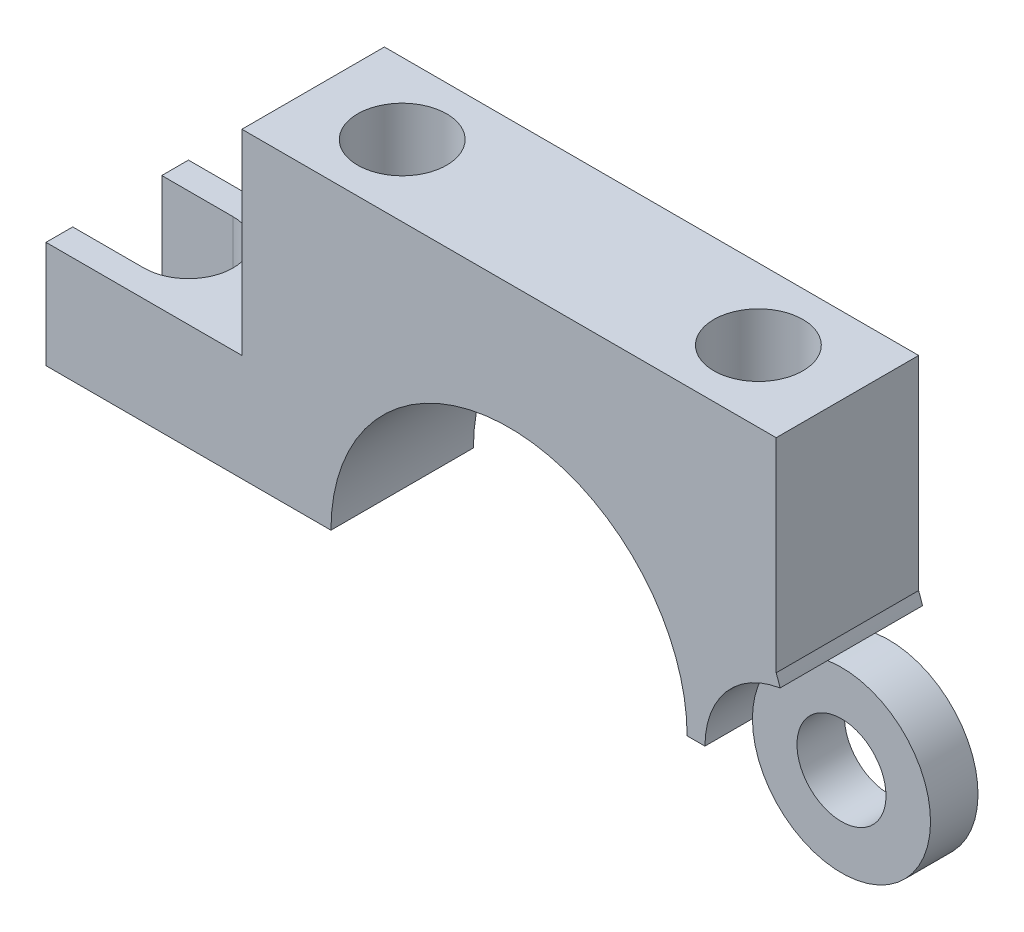
ISO-10303-21;
HEADER;
FILE_DESCRIPTION(('STEP AP214'),'2;1');
FILE_NAME('part.step','',(''),(''),'','','');
FILE_SCHEMA(('AUTOMOTIVE_DESIGN { 1 0 10303 214 1 1 1 1 }'));
ENDSEC;
DATA;
#1=APPLICATION_CONTEXT('core data for automotive mechanical design processes');
#2=APPLICATION_PROTOCOL_DEFINITION('international standard','automotive_design',2000,#1);
#3=PRODUCT_CONTEXT('',#1,'mechanical');
#4=PRODUCT('Part','Part','',(#3));
#5=PRODUCT_RELATED_PRODUCT_CATEGORY('part','',(#4));
#6=PRODUCT_DEFINITION_FORMATION('','',#4);
#7=PRODUCT_DEFINITION_CONTEXT('part definition',#1,'design');
#8=PRODUCT_DEFINITION('design','',#6,#7);
#9=PRODUCT_DEFINITION_SHAPE('','',#8);
#10=(LENGTH_UNIT() NAMED_UNIT(*) SI_UNIT(.MILLI.,.METRE.));
#11=(NAMED_UNIT(*) PLANE_ANGLE_UNIT() SI_UNIT($,.RADIAN.));
#12=(NAMED_UNIT(*) SI_UNIT($,.STERADIAN.) SOLID_ANGLE_UNIT());
#13=UNCERTAINTY_MEASURE_WITH_UNIT(LENGTH_MEASURE(1.E-05),#10,'distance_accuracy_value','');
#14=(GEOMETRIC_REPRESENTATION_CONTEXT(3) GLOBAL_UNCERTAINTY_ASSIGNED_CONTEXT((#13)) GLOBAL_UNIT_ASSIGNED_CONTEXT((#10,
#11,#12)) REPRESENTATION_CONTEXT('',''));
#15=CARTESIAN_POINT('',(0.,0.,0.));
#16=DIRECTION('',(0.,0.,1.));
#17=DIRECTION('',(1.,0.,0.));
#18=AXIS2_PLACEMENT_3D('',#15,#16,#17);
#19=CARTESIAN_POINT('',(0.,0.,2.));
#20=DIRECTION('',(0.,1.,0.));
#21=DIRECTION('',(0.,0.,1.));
#22=AXIS2_PLACEMENT_3D('',#19,#20,#21);
#23=PLANE('',#22);
#24=DIRECTION('',(0.,0.,-1.));
#25=VECTOR('',#24,1.);
#26=CARTESIAN_POINT('',(5.5,0.,9.07106781186548));
#27=LINE('',#26,#25);
#28=CARTESIAN_POINT('',(5.5,0.,2.));
#29=VERTEX_POINT('',#28);
#30=CARTESIAN_POINT('',(5.5,0.,0.666666666666667));
#31=VERTEX_POINT('',#30);
#32=EDGE_CURVE('E166',#29,#31,#27,.T.);
#33=ORIENTED_EDGE('',*,*,#32,.F.);
#34=DIRECTION('',(1.,0.,0.));
#35=VECTOR('',#34,1.);
#36=CARTESIAN_POINT('',(0.,0.,2.));
#37=LINE('',#36,#35);
#38=CARTESIAN_POINT('',(5.,0.,2.));
#39=VERTEX_POINT('',#38);
#40=EDGE_CURVE('E175',#39,#29,#37,.T.);
#41=ORIENTED_EDGE('',*,*,#40,.F.);
#42=DIRECTION('',(0.,0.,-1.));
#43=VECTOR('',#42,1.);
#44=CARTESIAN_POINT('',(5.,0.,2.));
#45=LINE('',#44,#43);
#46=CARTESIAN_POINT('',(5.,0.,-2.));
#47=VERTEX_POINT('',#46);
#48=EDGE_CURVE('E231',#39,#47,#45,.T.);
#49=ORIENTED_EDGE('',*,*,#48,.T.);
#50=DIRECTION('',(1.,0.,0.));
#51=VECTOR('',#50,1.);
#52=CARTESIAN_POINT('',(0.,0.,-2.));
#53=LINE('',#52,#51);
#54=CARTESIAN_POINT('',(5.5,0.,-2.));
#55=VERTEX_POINT('',#54);
#56=EDGE_CURVE('E206',#47,#55,#53,.T.);
#57=ORIENTED_EDGE('',*,*,#56,.T.);
#58=DIRECTION('',(0.,0.,1.));
#59=VECTOR('',#58,1.);
#60=CARTESIAN_POINT('',(5.5,0.,-9.07106781186548));
#61=LINE('',#60,#59);
#62=CARTESIAN_POINT('',(5.5,0.,-0.666666666666667));
#63=VERTEX_POINT('',#62);
#64=EDGE_CURVE('E294',#55,#63,#61,.T.);
#65=ORIENTED_EDGE('',*,*,#64,.T.);
#66=DIRECTION('',(0.,0.,-1.));
#67=VECTOR('',#66,1.);
#68=CARTESIAN_POINT('',(5.5,0.,0.666666666666667));
#69=LINE('',#68,#67);
#70=EDGE_CURVE('E203',#31,#63,#69,.T.);
#71=ORIENTED_EDGE('',*,*,#70,.F.);
#72=EDGE_LOOP('',(#33,#41,#49,#57,#65,#71));
#73=FACE_BOUND('',#72,.T.);
#74=ADVANCED_FACE('F40',(#73),#23,.F.);
#75=CARTESIAN_POINT('',(0.,0.,2.));
#76=DIRECTION('',(0.,0.,-1.));
#77=DIRECTION('',(-1.,0.,0.));
#78=AXIS2_PLACEMENT_3D('',#75,#76,#77);
#79=CYLINDRICAL_SURFACE('',#78,8.);
#80=CARTESIAN_POINT('',(0.,0.,2.));
#81=DIRECTION('',(0.,0.,1.));
#82=DIRECTION('',(1.,0.,0.));
#83=AXIS2_PLACEMENT_3D('',#80,#81,#82);
#84=CIRCLE('',#83,8.);
#85=CARTESIAN_POINT('',(7.5,2.78388218141501,2.));
#86=VERTEX_POINT('',#85);
#87=CARTESIAN_POINT('',(7.609375,2.46929384832486,2.));
#88=VERTEX_POINT('',#87);
#89=EDGE_CURVE('E173',#86,#88,#84,.F.);
#90=ORIENTED_EDGE('',*,*,#89,.T.);
#91=DIRECTION('',(0.,0.,-1.));
#92=VECTOR('',#91,1.);
#93=CARTESIAN_POINT('',(7.609375,2.46929384832486,1.33333333333333));
#94=LINE('',#93,#92);
#95=CARTESIAN_POINT('',(7.609375,2.46929384832486,0.666666666666667));
#96=VERTEX_POINT('',#95);
#97=EDGE_CURVE('E154',#88,#96,#94,.T.);
#98=ORIENTED_EDGE('',*,*,#97,.T.);
#99=DIRECTION('',(0.,0.,-1.));
#100=VECTOR('',#99,1.);
#101=CARTESIAN_POINT('',(7.609375,2.46929384832486,0.));
#102=LINE('',#101,#100);
#103=CARTESIAN_POINT('',(7.609375,2.46929384832486,-0.666666666666667));
#104=VERTEX_POINT('',#103);
#105=EDGE_CURVE('E238',#96,#104,#102,.T.);
#106=ORIENTED_EDGE('',*,*,#105,.T.);
#107=DIRECTION('',(0.,0.,1.));
#108=VECTOR('',#107,1.);
#109=CARTESIAN_POINT('',(7.609375,2.46929384832486,-1.33333333333333));
#110=LINE('',#109,#108);
#111=CARTESIAN_POINT('',(7.609375,2.46929384832486,-2.));
#112=VERTEX_POINT('',#111);
#113=EDGE_CURVE('E291',#112,#104,#110,.T.);
#114=ORIENTED_EDGE('',*,*,#113,.F.);
#115=CARTESIAN_POINT('',(0.,0.,-2.));
#116=DIRECTION('',(0.,0.,1.));
#117=DIRECTION('',(1.,0.,0.));
#118=AXIS2_PLACEMENT_3D('',#115,#116,#117);
#119=CIRCLE('',#118,8.);
#120=CARTESIAN_POINT('',(7.5,2.78388218141501,-2.));
#121=VERTEX_POINT('',#120);
#122=EDGE_CURVE('E210',#121,#112,#119,.F.);
#123=ORIENTED_EDGE('',*,*,#122,.F.);
#124=DIRECTION('',(0.,0.,-1.));
#125=VECTOR('',#124,1.);
#126=CARTESIAN_POINT('',(7.5,2.78388218141501,2.));
#127=LINE('',#126,#125);
#128=EDGE_CURVE('E181',#86,#121,#127,.T.);
#129=ORIENTED_EDGE('',*,*,#128,.F.);
#130=EDGE_LOOP('',(#90,#98,#106,#114,#123,#129));
#131=FACE_BOUND('',#130,.T.);
#132=ADVANCED_FACE('F179',(#131),#79,.T.);
#133=CARTESIAN_POINT('',(8.,0.,-5.53553390593274));
#134=DIRECTION('',(0.,0.,1.));
#135=DIRECTION('',(1.,0.,0.));
#136=AXIS2_PLACEMENT_3D('',#133,#134,#135);
#137=CYLINDRICAL_SURFACE('',#136,1.25);
#138=CARTESIAN_POINT('',(8.,0.,-0.666666666666667));
#139=DIRECTION('',(0.,0.,1.));
#140=DIRECTION('',(1.,0.,0.));
#141=AXIS2_PLACEMENT_3D('',#138,#139,#140);
#142=CIRCLE('',#141,1.25);
#143=CARTESIAN_POINT('',(9.25,0.,-0.666666666666667));
#144=VERTEX_POINT('',#143);
#145=EDGE_CURVE('E241',#144,#144,#142,.T.);
#146=ORIENTED_EDGE('',*,*,#145,.F.);
#147=EDGE_LOOP('',(#146));
#148=FACE_BOUND('',#147,.T.);
#149=CARTESIAN_POINT('',(8.,0.,0.666666666666667));
#150=DIRECTION('',(0.,0.,1.));
#151=DIRECTION('',(1.,0.,0.));
#152=AXIS2_PLACEMENT_3D('',#149,#150,#151);
#153=CIRCLE('',#152,1.25);
#154=CARTESIAN_POINT('',(9.25,0.,0.666666666666667));
#155=VERTEX_POINT('',#154);
#156=EDGE_CURVE('E346',#155,#155,#153,.T.);
#157=ORIENTED_EDGE('',*,*,#156,.T.);
#158=EDGE_LOOP('',(#157));
#159=FACE_BOUND('',#158,.T.);
#160=ADVANCED_FACE('F390',(#148,#159),#137,.F.);
#161=CARTESIAN_POINT('',(0.,3.,2.));
#162=DIRECTION('',(0.,1.,0.));
#163=DIRECTION('',(0.,0.,1.));
#164=AXIS2_PLACEMENT_3D('',#161,#162,#163);
#165=PLANE('',#164);
#166=DIRECTION('',(1.,0.,0.));
#167=VECTOR('',#166,1.);
#168=CARTESIAN_POINT('',(0.,3.,2.));
#169=LINE('',#168,#167);
#170=CARTESIAN_POINT('',(-13.,3.,2.));
#171=VERTEX_POINT('',#170);
#172=CARTESIAN_POINT('',(-7.5,3.,2.));
#173=VERTEX_POINT('',#172);
#174=EDGE_CURVE('E183',#171,#173,#169,.T.);
#175=ORIENTED_EDGE('',*,*,#174,.T.);
#176=DIRECTION('',(0.,0.,-1.));
#177=VECTOR('',#176,1.);
#178=CARTESIAN_POINT('',(-7.5,3.,2.));
#179=LINE('',#178,#177);
#180=CARTESIAN_POINT('',(-7.5,3.,-2.));
#181=VERTEX_POINT('',#180);
#182=EDGE_CURVE('E324',#173,#181,#179,.T.);
#183=ORIENTED_EDGE('',*,*,#182,.T.);
#184=DIRECTION('',(1.,0.,0.));
#185=VECTOR('',#184,1.);
#186=CARTESIAN_POINT('',(0.,3.,-2.));
#187=LINE('',#186,#185);
#188=CARTESIAN_POINT('',(-13.,3.,-2.));
#189=VERTEX_POINT('',#188);
#190=EDGE_CURVE('E213',#189,#181,#187,.T.);
#191=ORIENTED_EDGE('',*,*,#190,.F.);
#192=DIRECTION('',(0.,0.,-1.));
#193=VECTOR('',#192,1.);
#194=CARTESIAN_POINT('',(-13.,3.,2.));
#195=LINE('',#194,#193);
#196=CARTESIAN_POINT('',(-13.,3.,-1.25));
#197=VERTEX_POINT('',#196);
#198=EDGE_CURVE('E226',#197,#189,#195,.T.);
#199=ORIENTED_EDGE('',*,*,#198,.F.);
#200=DIRECTION('',(1.,0.,0.));
#201=VECTOR('',#200,1.);
#202=CARTESIAN_POINT('',(0.,3.,-1.25));
#203=LINE('',#202,#201);
#204=CARTESIAN_POINT('',(-11.,3.,-1.25));
#205=VERTEX_POINT('',#204);
#206=EDGE_CURVE('E262',#197,#205,#203,.T.);
#207=ORIENTED_EDGE('',*,*,#206,.T.);
#208=CARTESIAN_POINT('',(-11.,3.,0.));
#209=DIRECTION('',(0.,1.,0.));
#210=DIRECTION('',(0.,0.,1.));
#211=AXIS2_PLACEMENT_3D('',#208,#209,#210);
#212=CIRCLE('',#211,1.25);
#213=CARTESIAN_POINT('',(-11.,3.,1.25));
#214=VERTEX_POINT('',#213);
#215=EDGE_CURVE('E11',#214,#205,#212,.T.);
#216=ORIENTED_EDGE('',*,*,#215,.F.);
#217=DIRECTION('',(1.,0.,0.));
#218=VECTOR('',#217,1.);
#219=CARTESIAN_POINT('',(0.,3.,1.25));
#220=LINE('',#219,#218);
#221=CARTESIAN_POINT('',(-13.,3.,1.25));
#222=VERTEX_POINT('',#221);
#223=EDGE_CURVE('E341',#222,#214,#220,.T.);
#224=ORIENTED_EDGE('',*,*,#223,.F.);
#225=EDGE_CURVE('E227',#171,#222,#195,.T.);
#226=ORIENTED_EDGE('',*,*,#225,.F.);
#227=EDGE_LOOP('',(#175,#183,#191,#199,#207,#216,#224,#226));
#228=FACE_BOUND('',#227,.T.);
#229=ADVANCED_FACE('F260',(#228),#165,.T.);
#230=CARTESIAN_POINT('',(0.,0.,2.));
#231=DIRECTION('',(0.,-1.,0.));
#232=DIRECTION('',(0.,0.,-1.));
#233=AXIS2_PLACEMENT_3D('',#230,#231,#232);
#234=PLANE('',#233);
#235=CARTESIAN_POINT('',(-11.,0.,0.));
#236=DIRECTION('',(0.,1.,0.));
#237=DIRECTION('',(0.,0.,1.));
#238=AXIS2_PLACEMENT_3D('',#235,#236,#237);
#239=CIRCLE('',#238,1.25);
#240=CARTESIAN_POINT('',(-11.,0.,-1.25));
#241=VERTEX_POINT('',#240);
#242=CARTESIAN_POINT('',(-11.,0.,1.25));
#243=VERTEX_POINT('',#242);
#244=EDGE_CURVE('E327',#241,#243,#239,.F.);
#245=ORIENTED_EDGE('',*,*,#244,.F.);
#246=DIRECTION('',(-1.,0.,0.));
#247=VECTOR('',#246,1.);
#248=CARTESIAN_POINT('',(0.,0.,-1.25));
#249=LINE('',#248,#247);
#250=CARTESIAN_POINT('',(-13.,0.,-1.25));
#251=VERTEX_POINT('',#250);
#252=EDGE_CURVE('E269',#241,#251,#249,.T.);
#253=ORIENTED_EDGE('',*,*,#252,.T.);
#254=DIRECTION('',(0.,0.,-1.));
#255=VECTOR('',#254,1.);
#256=CARTESIAN_POINT('',(-13.,0.,2.));
#257=LINE('',#256,#255);
#258=CARTESIAN_POINT('',(-13.,0.,-2.));
#259=VERTEX_POINT('',#258);
#260=EDGE_CURVE('E197',#251,#259,#257,.T.);
#261=ORIENTED_EDGE('',*,*,#260,.T.);
#262=DIRECTION('',(-1.,0.,0.));
#263=VECTOR('',#262,1.);
#264=CARTESIAN_POINT('',(0.,0.,-2.));
#265=LINE('',#264,#263);
#266=CARTESIAN_POINT('',(-5.,0.,-2.));
#267=VERTEX_POINT('',#266);
#268=EDGE_CURVE('E198',#267,#259,#265,.T.);
#269=ORIENTED_EDGE('',*,*,#268,.F.);
#270=DIRECTION('',(0.,0.,-1.));
#271=VECTOR('',#270,1.);
#272=CARTESIAN_POINT('',(-5.,0.,2.));
#273=LINE('',#272,#271);
#274=CARTESIAN_POINT('',(-5.,0.,2.));
#275=VERTEX_POINT('',#274);
#276=EDGE_CURVE('E235',#275,#267,#273,.T.);
#277=ORIENTED_EDGE('',*,*,#276,.F.);
#278=DIRECTION('',(-1.,0.,0.));
#279=VECTOR('',#278,1.);
#280=CARTESIAN_POINT('',(0.,0.,2.));
#281=LINE('',#280,#279);
#282=CARTESIAN_POINT('',(-13.,0.,2.));
#283=VERTEX_POINT('',#282);
#284=EDGE_CURVE('E221',#275,#283,#281,.T.);
#285=ORIENTED_EDGE('',*,*,#284,.T.);
#286=CARTESIAN_POINT('',(-13.,0.,1.25));
#287=VERTEX_POINT('',#286);
#288=EDGE_CURVE('E222',#283,#287,#257,.T.);
#289=ORIENTED_EDGE('',*,*,#288,.T.);
#290=DIRECTION('',(-1.,0.,0.));
#291=VECTOR('',#290,1.);
#292=CARTESIAN_POINT('',(0.,0.,1.25));
#293=LINE('',#292,#291);
#294=EDGE_CURVE('E64',#243,#287,#293,.T.);
#295=ORIENTED_EDGE('',*,*,#294,.F.);
#296=EDGE_LOOP('',(#245,#253,#261,#269,#277,#285,#289,#295));
#297=FACE_BOUND('',#296,.T.);
#298=ADVANCED_FACE('F42',(#297),#234,.T.);
#299=CARTESIAN_POINT('',(-13.,0.,2.));
#300=DIRECTION('',(-1.,0.,0.));
#301=DIRECTION('',(0.,0.,1.));
#302=AXIS2_PLACEMENT_3D('',#299,#300,#301);
#303=PLANE('',#302);
#304=ORIENTED_EDGE('',*,*,#260,.F.);
#305=DIRECTION('',(0.,1.,0.));
#306=VECTOR('',#305,1.);
#307=CARTESIAN_POINT('',(-13.,0.,-1.25));
#308=LINE('',#307,#306);
#309=EDGE_CURVE('E49',#251,#197,#308,.T.);
#310=ORIENTED_EDGE('',*,*,#309,.T.);
#311=ORIENTED_EDGE('',*,*,#198,.T.);
#312=DIRECTION('',(0.,1.,0.));
#313=VECTOR('',#312,1.);
#314=CARTESIAN_POINT('',(-13.,0.,-2.));
#315=LINE('',#314,#313);
#316=EDGE_CURVE('E217',#259,#189,#315,.T.);
#317=ORIENTED_EDGE('',*,*,#316,.F.);
#318=EDGE_LOOP('',(#304,#310,#311,#317));
#319=FACE_BOUND('',#318,.T.);
#320=ADVANCED_FACE('F252',(#319),#303,.T.);
#321=CARTESIAN_POINT('',(0.,0.,2.));
#322=DIRECTION('',(0.,0.,-1.));
#323=DIRECTION('',(-1.,0.,0.));
#324=AXIS2_PLACEMENT_3D('',#321,#322,#323);
#325=CYLINDRICAL_SURFACE('',#324,5.);
#326=CARTESIAN_POINT('',(0.,0.,-2.));
#327=DIRECTION('',(0.,0.,1.));
#328=DIRECTION('',(1.,0.,0.));
#329=AXIS2_PLACEMENT_3D('',#326,#327,#328);
#330=CIRCLE('',#329,5.);
#331=EDGE_CURVE('E202',#267,#47,#330,.F.);
#332=ORIENTED_EDGE('',*,*,#331,.T.);
#333=ORIENTED_EDGE('',*,*,#48,.F.);
#334=CARTESIAN_POINT('',(0.,0.,2.));
#335=DIRECTION('',(0.,0.,1.));
#336=DIRECTION('',(1.,0.,0.));
#337=AXIS2_PLACEMENT_3D('',#334,#335,#336);
#338=CIRCLE('',#337,5.);
#339=EDGE_CURVE('E190',#275,#39,#338,.F.);
#340=ORIENTED_EDGE('',*,*,#339,.F.);
#341=ORIENTED_EDGE('',*,*,#276,.T.);
#342=EDGE_LOOP('',(#332,#333,#340,#341));
#343=FACE_BOUND('',#342,.T.);
#344=ADVANCED_FACE('F276',(#343),#325,.F.);
#345=DIRECTION('',(0.,1.,0.));
#346=VECTOR('',#345,1.);
#347=CARTESIAN_POINT('',(-13.,0.,1.25));
#348=LINE('',#347,#346);
#349=EDGE_CURVE('E245',#287,#222,#348,.T.);
#350=ORIENTED_EDGE('',*,*,#349,.F.);
#351=ORIENTED_EDGE('',*,*,#288,.F.);
#352=DIRECTION('',(0.,1.,0.));
#353=VECTOR('',#352,1.);
#354=CARTESIAN_POINT('',(-13.,0.,2.));
#355=LINE('',#354,#353);
#356=EDGE_CURVE('E188',#283,#171,#355,.T.);
#357=ORIENTED_EDGE('',*,*,#356,.T.);
#358=ORIENTED_EDGE('',*,*,#225,.T.);
#359=EDGE_LOOP('',(#350,#351,#357,#358));
#360=FACE_BOUND('',#359,.T.);
#361=ADVANCED_FACE('F367',(#360),#303,.T.);
#362=CARTESIAN_POINT('',(0.,0.,2.));
#363=DIRECTION('',(0.,0.,1.));
#364=DIRECTION('',(1.,0.,0.));
#365=AXIS2_PLACEMENT_3D('',#362,#363,#364);
#366=PLANE('',#365);
#367=ORIENTED_EDGE('',*,*,#40,.T.);
#368=CARTESIAN_POINT('',(8.,0.,2.));
#369=DIRECTION('',(0.,0.,1.));
#370=DIRECTION('',(1.,0.,0.));
#371=AXIS2_PLACEMENT_3D('',#368,#369,#370);
#372=CIRCLE('',#371,2.5);
#373=EDGE_CURVE('E157',#88,#29,#372,.T.);
#374=ORIENTED_EDGE('',*,*,#373,.F.);
#375=ORIENTED_EDGE('',*,*,#89,.F.);
#376=DIRECTION('',(0.,-1.,0.));
#377=VECTOR('',#376,1.);
#378=CARTESIAN_POINT('',(7.5,0.,2.));
#379=LINE('',#378,#377);
#380=CARTESIAN_POINT('',(7.5,8.5,2.));
#381=VERTEX_POINT('',#380);
#382=EDGE_CURVE('E302',#381,#86,#379,.T.);
#383=ORIENTED_EDGE('',*,*,#382,.F.);
#384=DIRECTION('',(1.,0.,0.));
#385=VECTOR('',#384,1.);
#386=CARTESIAN_POINT('',(0.,8.5,2.));
#387=LINE('',#386,#385);
#388=CARTESIAN_POINT('',(-7.5,8.5,2.));
#389=VERTEX_POINT('',#388);
#390=EDGE_CURVE('E306',#389,#381,#387,.T.);
#391=ORIENTED_EDGE('',*,*,#390,.F.);
#392=DIRECTION('',(0.,-1.,0.));
#393=VECTOR('',#392,1.);
#394=CARTESIAN_POINT('',(-7.5,0.,2.));
#395=LINE('',#394,#393);
#396=EDGE_CURVE('E298',#389,#173,#395,.T.);
#397=ORIENTED_EDGE('',*,*,#396,.T.);
#398=ORIENTED_EDGE('',*,*,#174,.F.);
#399=ORIENTED_EDGE('',*,*,#356,.F.);
#400=ORIENTED_EDGE('',*,*,#284,.F.);
#401=ORIENTED_EDGE('',*,*,#339,.T.);
#402=EDGE_LOOP('',(#367,#374,#375,#383,#391,#397,#398,#399,#400,#401));
#403=FACE_BOUND('',#402,.T.);
#404=ADVANCED_FACE('F171',(#403),#366,.T.);
#405=CARTESIAN_POINT('',(0.,0.,-2.));
#406=DIRECTION('',(0.,0.,1.));
#407=DIRECTION('',(1.,0.,0.));
#408=AXIS2_PLACEMENT_3D('',#405,#406,#407);
#409=PLANE('',#408);
#410=ORIENTED_EDGE('',*,*,#122,.T.);
#411=CARTESIAN_POINT('',(8.,0.,-2.));
#412=DIRECTION('',(0.,0.,1.));
#413=DIRECTION('',(1.,0.,0.));
#414=AXIS2_PLACEMENT_3D('',#411,#412,#413);
#415=CIRCLE('',#414,2.5);
#416=EDGE_CURVE('E286',#55,#112,#415,.F.);
#417=ORIENTED_EDGE('',*,*,#416,.F.);
#418=ORIENTED_EDGE('',*,*,#56,.F.);
#419=ORIENTED_EDGE('',*,*,#331,.F.);
#420=ORIENTED_EDGE('',*,*,#268,.T.);
#421=ORIENTED_EDGE('',*,*,#316,.T.);
#422=ORIENTED_EDGE('',*,*,#190,.T.);
#423=DIRECTION('',(0.,-1.,0.));
#424=VECTOR('',#423,1.);
#425=CARTESIAN_POINT('',(-7.5,0.,-2.));
#426=LINE('',#425,#424);
#427=CARTESIAN_POINT('',(-7.5,8.5,-2.));
#428=VERTEX_POINT('',#427);
#429=EDGE_CURVE('E297',#428,#181,#426,.T.);
#430=ORIENTED_EDGE('',*,*,#429,.F.);
#431=DIRECTION('',(1.,0.,0.));
#432=VECTOR('',#431,1.);
#433=CARTESIAN_POINT('',(0.,8.5,-2.));
#434=LINE('',#433,#432);
#435=CARTESIAN_POINT('',(7.5,8.5,-2.));
#436=VERTEX_POINT('',#435);
#437=EDGE_CURVE('E303',#428,#436,#434,.T.);
#438=ORIENTED_EDGE('',*,*,#437,.T.);
#439=DIRECTION('',(0.,-1.,0.));
#440=VECTOR('',#439,1.);
#441=CARTESIAN_POINT('',(7.5,0.,-2.));
#442=LINE('',#441,#440);
#443=EDGE_CURVE('E56',#436,#121,#442,.T.);
#444=ORIENTED_EDGE('',*,*,#443,.T.);
#445=EDGE_LOOP('',(#410,#417,#418,#419,#420,#421,#422,#430,#438,#444));
#446=FACE_BOUND('',#445,.T.);
#447=ADVANCED_FACE('F271',(#446),#409,.F.);
#448=CARTESIAN_POINT('',(8.,0.,0.666666666666667));
#449=DIRECTION('',(0.,0.,-1.));
#450=DIRECTION('',(-1.,0.,0.));
#451=AXIS2_PLACEMENT_3D('',#448,#449,#450);
#452=CYLINDRICAL_SURFACE('',#451,2.5);
#453=CARTESIAN_POINT('',(8.,0.,0.666666666666667));
#454=DIRECTION('',(0.,0.,1.));
#455=DIRECTION('',(1.,0.,0.));
#456=AXIS2_PLACEMENT_3D('',#453,#454,#455);
#457=CIRCLE('',#456,2.5);
#458=EDGE_CURVE('E351',#31,#96,#457,.T.);
#459=ORIENTED_EDGE('',*,*,#458,.F.);
#460=ORIENTED_EDGE('',*,*,#70,.T.);
#461=CARTESIAN_POINT('',(8.,0.,-0.666666666666667));
#462=DIRECTION('',(0.,0.,1.));
#463=DIRECTION('',(1.,0.,0.));
#464=AXIS2_PLACEMENT_3D('',#461,#462,#463);
#465=CIRCLE('',#464,2.5);
#466=EDGE_CURVE('E350',#63,#104,#465,.T.);
#467=ORIENTED_EDGE('',*,*,#466,.T.);
#468=ORIENTED_EDGE('',*,*,#105,.F.);
#469=EDGE_LOOP('',(#459,#460,#467,#468));
#470=FACE_BOUND('',#469,.T.);
#471=ADVANCED_FACE('F418',(#470),#452,.T.);
#472=CARTESIAN_POINT('',(8.,0.,0.666666666666667));
#473=DIRECTION('',(0.,0.,1.));
#474=DIRECTION('',(1.,0.,0.));
#475=AXIS2_PLACEMENT_3D('',#472,#473,#474);
#476=PLANE('',#475);
#477=ORIENTED_EDGE('',*,*,#156,.F.);
#478=EDGE_LOOP('',(#477));
#479=FACE_BOUND('',#478,.T.);
#480=CARTESIAN_POINT('',(8.,0.,0.666666666666667));
#481=DIRECTION('',(0.,0.,1.));
#482=DIRECTION('',(1.,0.,0.));
#483=AXIS2_PLACEMENT_3D('',#480,#481,#482);
#484=CIRCLE('',#483,2.5);
#485=EDGE_CURVE('E160',#96,#31,#484,.T.);
#486=ORIENTED_EDGE('',*,*,#485,.T.);
#487=ORIENTED_EDGE('',*,*,#458,.T.);
#488=EDGE_LOOP('',(#486,#487));
#489=FACE_BOUND('',#488,.T.);
#490=ADVANCED_FACE('F415',(#479,#489),#476,.T.);
#491=CARTESIAN_POINT('',(8.,0.,-0.666666666666667));
#492=DIRECTION('',(0.,0.,1.));
#493=DIRECTION('',(1.,0.,0.));
#494=AXIS2_PLACEMENT_3D('',#491,#492,#493);
#495=PLANE('',#494);
#496=ORIENTED_EDGE('',*,*,#145,.T.);
#497=EDGE_LOOP('',(#496));
#498=FACE_BOUND('',#497,.T.);
#499=ORIENTED_EDGE('',*,*,#466,.F.);
#500=CARTESIAN_POINT('',(8.,0.,-0.666666666666667));
#501=DIRECTION('',(0.,0.,1.));
#502=DIRECTION('',(1.,0.,0.));
#503=AXIS2_PLACEMENT_3D('',#500,#501,#502);
#504=CIRCLE('',#503,2.5);
#505=EDGE_CURVE('E283',#104,#63,#504,.T.);
#506=ORIENTED_EDGE('',*,*,#505,.F.);
#507=EDGE_LOOP('',(#499,#506));
#508=FACE_BOUND('',#507,.T.);
#509=ADVANCED_FACE('F383',(#498,#508),#495,.F.);
#510=CARTESIAN_POINT('',(-11.,8.,0.));
#511=DIRECTION('',(0.,-1.,0.));
#512=DIRECTION('',(0.,0.,-1.));
#513=AXIS2_PLACEMENT_3D('',#510,#511,#512);
#514=CYLINDRICAL_SURFACE('',#513,1.25);
#515=ORIENTED_EDGE('',*,*,#215,.T.);
#516=DIRECTION('',(0.,-1.,0.));
#517=VECTOR('',#516,1.);
#518=CARTESIAN_POINT('',(-11.,8.,-1.25));
#519=LINE('',#518,#517);
#520=EDGE_CURVE('E338',#205,#241,#519,.T.);
#521=ORIENTED_EDGE('',*,*,#520,.T.);
#522=ORIENTED_EDGE('',*,*,#244,.T.);
#523=DIRECTION('',(0.,-1.,0.));
#524=VECTOR('',#523,1.);
#525=CARTESIAN_POINT('',(-11.,8.,1.25));
#526=LINE('',#525,#524);
#527=EDGE_CURVE('E335',#214,#243,#526,.T.);
#528=ORIENTED_EDGE('',*,*,#527,.F.);
#529=EDGE_LOOP('',(#515,#521,#522,#528));
#530=FACE_BOUND('',#529,.T.);
#531=ADVANCED_FACE('F373',(#530),#514,.F.);
#532=CARTESIAN_POINT('',(0.,8.,-1.25));
#533=DIRECTION('',(0.,0.,1.));
#534=DIRECTION('',(1.,0.,0.));
#535=AXIS2_PLACEMENT_3D('',#532,#533,#534);
#536=PLANE('',#535);
#537=ORIENTED_EDGE('',*,*,#309,.F.);
#538=ORIENTED_EDGE('',*,*,#252,.F.);
#539=ORIENTED_EDGE('',*,*,#520,.F.);
#540=ORIENTED_EDGE('',*,*,#206,.F.);
#541=EDGE_LOOP('',(#537,#538,#539,#540));
#542=FACE_BOUND('',#541,.T.);
#543=ADVANCED_FACE('F374',(#542),#536,.T.);
#544=CARTESIAN_POINT('',(0.,8.,1.25));
#545=DIRECTION('',(0.,0.,1.));
#546=DIRECTION('',(1.,0.,0.));
#547=AXIS2_PLACEMENT_3D('',#544,#545,#546);
#548=PLANE('',#547);
#549=ORIENTED_EDGE('',*,*,#223,.T.);
#550=ORIENTED_EDGE('',*,*,#527,.T.);
#551=ORIENTED_EDGE('',*,*,#294,.T.);
#552=ORIENTED_EDGE('',*,*,#349,.T.);
#553=EDGE_LOOP('',(#549,#550,#551,#552));
#554=FACE_BOUND('',#553,.T.);
#555=ADVANCED_FACE('F369',(#554),#548,.F.);
#556=CARTESIAN_POINT('',(-7.5,0.,2.));
#557=DIRECTION('',(1.,0.,0.));
#558=DIRECTION('',(0.,1.,0.));
#559=AXIS2_PLACEMENT_3D('',#556,#557,#558);
#560=PLANE('',#559);
#561=ORIENTED_EDGE('',*,*,#182,.F.);
#562=ORIENTED_EDGE('',*,*,#396,.F.);
#563=DIRECTION('',(0.,0.,-1.));
#564=VECTOR('',#563,1.);
#565=CARTESIAN_POINT('',(-7.5,8.5,2.));
#566=LINE('',#565,#564);
#567=EDGE_CURVE('E310',#389,#428,#566,.T.);
#568=ORIENTED_EDGE('',*,*,#567,.T.);
#569=ORIENTED_EDGE('',*,*,#429,.T.);
#570=EDGE_LOOP('',(#561,#562,#568,#569));
#571=FACE_BOUND('',#570,.T.);
#572=ADVANCED_FACE('F381',(#571),#560,.F.);
#573=CARTESIAN_POINT('',(7.5,0.,2.));
#574=DIRECTION('',(1.,0.,0.));
#575=DIRECTION('',(0.,0.,-1.));
#576=AXIS2_PLACEMENT_3D('',#573,#574,#575);
#577=PLANE('',#576);
#578=ORIENTED_EDGE('',*,*,#443,.F.);
#579=DIRECTION('',(0.,0.,-1.));
#580=VECTOR('',#579,1.);
#581=CARTESIAN_POINT('',(7.5,8.5,2.));
#582=LINE('',#581,#580);
#583=EDGE_CURVE('E319',#381,#436,#582,.T.);
#584=ORIENTED_EDGE('',*,*,#583,.F.);
#585=ORIENTED_EDGE('',*,*,#382,.T.);
#586=ORIENTED_EDGE('',*,*,#128,.T.);
#587=EDGE_LOOP('',(#578,#584,#585,#586));
#588=FACE_BOUND('',#587,.T.);
#589=ADVANCED_FACE('F477',(#588),#577,.T.);
#590=CARTESIAN_POINT('',(0.,8.5,2.));
#591=DIRECTION('',(0.,1.,0.));
#592=DIRECTION('',(-1.,0.,0.));
#593=AXIS2_PLACEMENT_3D('',#590,#591,#592);
#594=PLANE('',#593);
#595=CARTESIAN_POINT('',(-5.,8.5,0.));
#596=DIRECTION('',(0.,1.,0.));
#597=DIRECTION('',(-1.,0.,0.));
#598=AXIS2_PLACEMENT_3D('',#595,#596,#597);
#599=CIRCLE('',#598,1.25);
#600=CARTESIAN_POINT('',(-6.25,8.5,0.));
#601=VERTEX_POINT('',#600);
#602=EDGE_CURVE('E619',#601,#601,#599,.T.);
#603=ORIENTED_EDGE('',*,*,#602,.F.);
#604=EDGE_LOOP('',(#603));
#605=FACE_BOUND('',#604,.T.);
#606=CARTESIAN_POINT('',(5.,8.5,0.));
#607=DIRECTION('',(0.,1.,0.));
#608=DIRECTION('',(-1.,0.,0.));
#609=AXIS2_PLACEMENT_3D('',#606,#607,#608);
#610=CIRCLE('',#609,1.25);
#611=CARTESIAN_POINT('',(3.75,8.5,0.));
#612=VERTEX_POINT('',#611);
#613=EDGE_CURVE('E631',#612,#612,#610,.T.);
#614=ORIENTED_EDGE('',*,*,#613,.F.);
#615=EDGE_LOOP('',(#614));
#616=FACE_BOUND('',#615,.T.);
#617=ORIENTED_EDGE('',*,*,#437,.F.);
#618=ORIENTED_EDGE('',*,*,#567,.F.);
#619=ORIENTED_EDGE('',*,*,#390,.T.);
#620=ORIENTED_EDGE('',*,*,#583,.T.);
#621=EDGE_LOOP('',(#617,#618,#619,#620));
#622=FACE_BOUND('',#621,.T.);
#623=ADVANCED_FACE('F486',(#605,#616,#622),#594,.T.);
#624=CARTESIAN_POINT('',(8.,0.,-9.07106781186548));
#625=DIRECTION('',(0.,0.,1.));
#626=DIRECTION('',(1.,0.,0.));
#627=AXIS2_PLACEMENT_3D('',#624,#625,#626);
#628=CYLINDRICAL_SURFACE('',#627,2.5);
#629=ORIENTED_EDGE('',*,*,#416,.T.);
#630=ORIENTED_EDGE('',*,*,#113,.T.);
#631=ORIENTED_EDGE('',*,*,#505,.T.);
#632=ORIENTED_EDGE('',*,*,#64,.F.);
#633=EDGE_LOOP('',(#629,#630,#631,#632));
#634=FACE_BOUND('',#633,.T.);
#635=ADVANCED_FACE('F497',(#634),#628,.F.);
#636=CARTESIAN_POINT('',(8.,0.,9.07106781186548));
#637=DIRECTION('',(0.,0.,-1.));
#638=DIRECTION('',(-1.,0.,0.));
#639=AXIS2_PLACEMENT_3D('',#636,#637,#638);
#640=CYLINDRICAL_SURFACE('',#639,2.5);
#641=ORIENTED_EDGE('',*,*,#32,.T.);
#642=ORIENTED_EDGE('',*,*,#485,.F.);
#643=ORIENTED_EDGE('',*,*,#97,.F.);
#644=ORIENTED_EDGE('',*,*,#373,.T.);
#645=EDGE_LOOP('',(#641,#642,#643,#644));
#646=FACE_BOUND('',#645,.T.);
#647=ADVANCED_FACE('F156',(#646),#640,.F.);
#648=CARTESIAN_POINT('',(5.,3.5,0.));
#649=DIRECTION('',(0.,1.,0.));
#650=DIRECTION('',(-1.,0.,0.));
#651=AXIS2_PLACEMENT_3D('',#648,#649,#650);
#652=CYLINDRICAL_SURFACE('',#651,1.25);
#653=CARTESIAN_POINT('',(5.,3.5,0.));
#654=DIRECTION('',(0.,1.,0.));
#655=DIRECTION('',(-1.,0.,0.));
#656=AXIS2_PLACEMENT_3D('',#653,#654,#655);
#657=CIRCLE('',#656,1.25);
#658=CARTESIAN_POINT('',(3.75,3.5,0.));
#659=VERTEX_POINT('',#658);
#660=EDGE_CURVE('E625',#659,#659,#657,.T.);
#661=ORIENTED_EDGE('',*,*,#660,.F.);
#662=EDGE_LOOP('',(#661));
#663=FACE_BOUND('',#662,.T.);
#664=ORIENTED_EDGE('',*,*,#613,.T.);
#665=EDGE_LOOP('',(#664));
#666=FACE_BOUND('',#665,.T.);
#667=ADVANCED_FACE('F512',(#663,#666),#652,.F.);
#668=CARTESIAN_POINT('',(5.,3.5,0.));
#669=DIRECTION('',(0.,1.,0.));
#670=DIRECTION('',(-1.,0.,0.));
#671=AXIS2_PLACEMENT_3D('',#668,#669,#670);
#672=PLANE('',#671);
#673=ORIENTED_EDGE('',*,*,#660,.T.);
#674=EDGE_LOOP('',(#673));
#675=FACE_BOUND('',#674,.T.);
#676=ADVANCED_FACE('F518',(#675),#672,.T.);
#677=CARTESIAN_POINT('',(-5.,3.5,0.));
#678=DIRECTION('',(0.,1.,0.));
#679=DIRECTION('',(-1.,0.,0.));
#680=AXIS2_PLACEMENT_3D('',#677,#678,#679);
#681=CYLINDRICAL_SURFACE('',#680,1.25);
#682=CARTESIAN_POINT('',(-5.,3.5,0.));
#683=DIRECTION('',(0.,1.,0.));
#684=DIRECTION('',(-1.,0.,0.));
#685=AXIS2_PLACEMENT_3D('',#682,#683,#684);
#686=CIRCLE('',#685,1.25);
#687=CARTESIAN_POINT('',(-6.25,3.5,0.));
#688=VERTEX_POINT('',#687);
#689=EDGE_CURVE('E617',#688,#688,#686,.T.);
#690=ORIENTED_EDGE('',*,*,#689,.F.);
#691=EDGE_LOOP('',(#690));
#692=FACE_BOUND('',#691,.T.);
#693=ORIENTED_EDGE('',*,*,#602,.T.);
#694=EDGE_LOOP('',(#693));
#695=FACE_BOUND('',#694,.T.);
#696=ADVANCED_FACE('F526',(#692,#695),#681,.F.);
#697=CARTESIAN_POINT('',(-5.,3.5,0.));
#698=DIRECTION('',(0.,1.,0.));
#699=DIRECTION('',(-1.,0.,0.));
#700=AXIS2_PLACEMENT_3D('',#697,#698,#699);
#701=PLANE('',#700);
#702=ORIENTED_EDGE('',*,*,#689,.T.);
#703=EDGE_LOOP('',(#702));
#704=FACE_BOUND('',#703,.T.);
#705=ADVANCED_FACE('F534',(#704),#701,.T.);
#706=CLOSED_SHELL('',(#74,#132,#160,#229,#298,#320,#344,#361,#404,#447,#471,#490,#509,#531,#543,
#555,#572,#589,#623,#635,#647,#667,#676,#696,#705));
#707=MANIFOLD_SOLID_BREP('B2',#706);
#708=ADVANCED_BREP_SHAPE_REPRESENTATION('',(#18,#707),#14);
#709=SHAPE_DEFINITION_REPRESENTATION(#9,#708);
ENDSEC;
END-ISO-10303-21;
